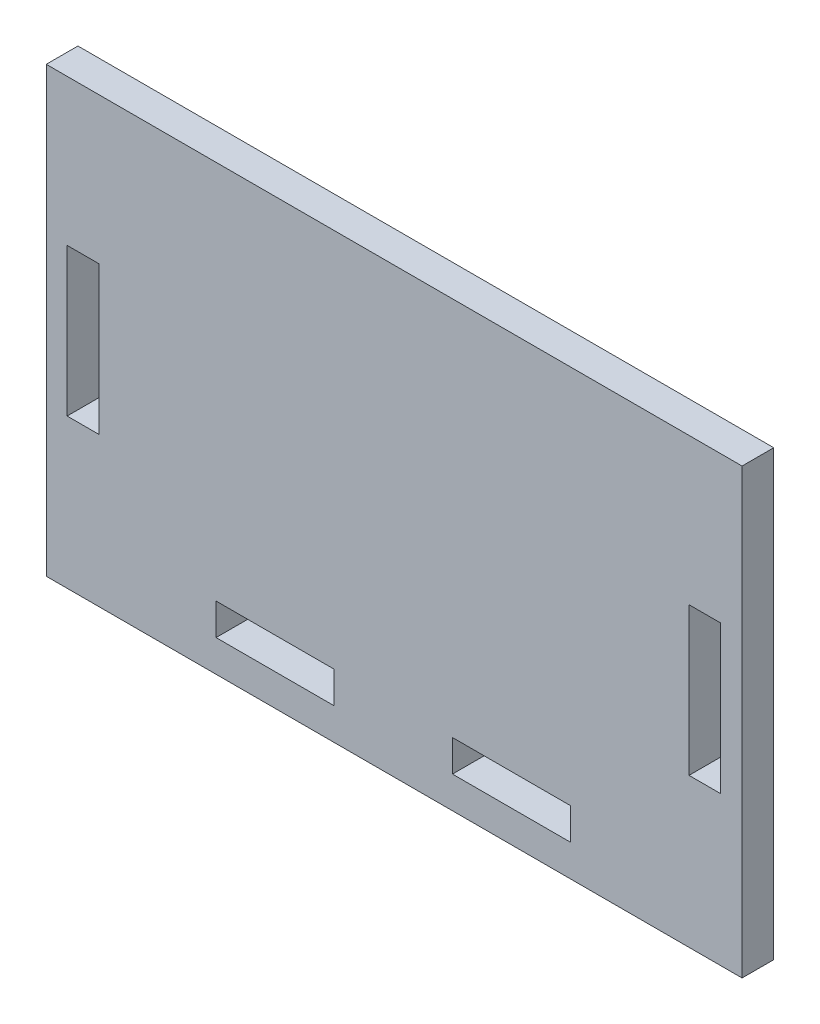
ISO-10303-21;
HEADER;
FILE_DESCRIPTION(('STEP AP214'),'2;1');
FILE_NAME('part.step','',(''),(''),'','','');
FILE_SCHEMA(('AUTOMOTIVE_DESIGN { 1 0 10303 214 1 1 1 1 }'));
ENDSEC;
DATA;
#1=APPLICATION_CONTEXT('core data for automotive mechanical design processes');
#2=APPLICATION_PROTOCOL_DEFINITION('international standard','automotive_design',2000,#1);
#3=PRODUCT_CONTEXT('',#1,'mechanical');
#4=PRODUCT('Part','Part','',(#3));
#5=PRODUCT_RELATED_PRODUCT_CATEGORY('part','',(#4));
#6=PRODUCT_DEFINITION_FORMATION('','',#4);
#7=PRODUCT_DEFINITION_CONTEXT('part definition',#1,'design');
#8=PRODUCT_DEFINITION('design','',#6,#7);
#9=PRODUCT_DEFINITION_SHAPE('','',#8);
#10=(LENGTH_UNIT() NAMED_UNIT(*) SI_UNIT(.MILLI.,.METRE.));
#11=(NAMED_UNIT(*) PLANE_ANGLE_UNIT() SI_UNIT($,.RADIAN.));
#12=(NAMED_UNIT(*) SI_UNIT($,.STERADIAN.) SOLID_ANGLE_UNIT());
#13=UNCERTAINTY_MEASURE_WITH_UNIT(LENGTH_MEASURE(1.E-05),#10,'distance_accuracy_value','');
#14=(GEOMETRIC_REPRESENTATION_CONTEXT(3) GLOBAL_UNCERTAINTY_ASSIGNED_CONTEXT((#13)) GLOBAL_UNIT_ASSIGNED_CONTEXT((#10,
#11,#12)) REPRESENTATION_CONTEXT('',''));
#15=CARTESIAN_POINT('',(0.,0.,0.));
#16=DIRECTION('',(0.,0.,1.));
#17=DIRECTION('',(1.,0.,0.));
#18=AXIS2_PLACEMENT_3D('',#15,#16,#17);
#19=CARTESIAN_POINT('',(0.,0.,3.));
#20=DIRECTION('',(0.,0.,1.));
#21=DIRECTION('',(1.,0.,0.));
#22=AXIS2_PLACEMENT_3D('',#19,#20,#21);
#23=PLANE('',#22);
#24=DIRECTION('',(0.,-1.,0.));
#25=VECTOR('',#24,1.);
#26=CARTESIAN_POINT('',(0.253835648564402,41.7682431755537,3.));
#27=LINE('',#26,#25);
#28=CARTESIAN_POINT('',(0.253835648564402,41.7682431755537,3.));
#29=VERTEX_POINT('',#28);
#30=CARTESIAN_POINT('',(0.253835648564407,-0.231756824446303,3.));
#31=VERTEX_POINT('',#30);
#32=EDGE_CURVE('E299',#29,#31,#27,.T.);
#33=ORIENTED_EDGE('',*,*,#32,.T.);
#34=DIRECTION('',(1.,0.,0.));
#35=VECTOR('',#34,1.);
#36=CARTESIAN_POINT('',(0.253835648564407,-0.231756824446303,3.));
#37=LINE('',#36,#35);
#38=CARTESIAN_POINT('',(66.1638356485644,-0.231756824446303,3.));
#39=VERTEX_POINT('',#38);
#40=EDGE_CURVE('E302',#31,#39,#37,.T.);
#41=ORIENTED_EDGE('',*,*,#40,.T.);
#42=DIRECTION('',(0.,1.,0.));
#43=VECTOR('',#42,1.);
#44=CARTESIAN_POINT('',(66.1638356485644,41.7682431755537,3.));
#45=LINE('',#44,#43);
#46=CARTESIAN_POINT('',(66.1638356485644,41.7682431755537,3.));
#47=VERTEX_POINT('',#46);
#48=EDGE_CURVE('E305',#39,#47,#45,.T.);
#49=ORIENTED_EDGE('',*,*,#48,.T.);
#50=DIRECTION('',(-1.,0.,0.));
#51=VECTOR('',#50,1.);
#52=CARTESIAN_POINT('',(0.253835648564402,41.7682431755537,3.));
#53=LINE('',#52,#51);
#54=EDGE_CURVE('E307',#47,#29,#53,.T.);
#55=ORIENTED_EDGE('',*,*,#54,.T.);
#56=EDGE_LOOP('',(#33,#41,#49,#55));
#57=FACE_BOUND('',#56,.T.);
#58=DIRECTION('',(1.,0.,0.));
#59=VECTOR('',#58,1.);
#60=CARTESIAN_POINT('',(64.1411254267085,13.8773632460001,3.));
#61=LINE('',#60,#59);
#62=CARTESIAN_POINT('',(61.1366118367289,13.8773632460001,3.));
#63=VERTEX_POINT('',#62);
#64=CARTESIAN_POINT('',(64.1411254267085,13.8773632460001,3.));
#65=VERTEX_POINT('',#64);
#66=EDGE_CURVE('E270',#63,#65,#61,.T.);
#67=ORIENTED_EDGE('',*,*,#66,.F.);
#68=DIRECTION('',(0.,-1.,0.));
#69=VECTOR('',#68,1.);
#70=CARTESIAN_POINT('',(61.1366118367289,27.8773632460001,3.));
#71=LINE('',#70,#69);
#72=CARTESIAN_POINT('',(61.1366118367289,27.8773632460001,3.));
#73=VERTEX_POINT('',#72);
#74=EDGE_CURVE('E268',#73,#63,#71,.T.);
#75=ORIENTED_EDGE('',*,*,#74,.F.);
#76=DIRECTION('',(-1.,0.,0.));
#77=VECTOR('',#76,1.);
#78=CARTESIAN_POINT('',(64.1411254267085,27.8773632460001,3.));
#79=LINE('',#78,#77);
#80=CARTESIAN_POINT('',(64.1411254267085,27.8773632460001,3.));
#81=VERTEX_POINT('',#80);
#82=EDGE_CURVE('E276',#81,#73,#79,.T.);
#83=ORIENTED_EDGE('',*,*,#82,.F.);
#84=DIRECTION('',(0.,1.,0.));
#85=VECTOR('',#84,1.);
#86=CARTESIAN_POINT('',(64.1411254267085,27.8773632460001,3.));
#87=LINE('',#86,#85);
#88=EDGE_CURVE('E273',#65,#81,#87,.T.);
#89=ORIENTED_EDGE('',*,*,#88,.F.);
#90=EDGE_LOOP('',(#67,#75,#83,#89));
#91=FACE_BOUND('',#90,.T.);
#92=DIRECTION('',(1.,0.,0.));
#93=VECTOR('',#92,1.);
#94=CARTESIAN_POINT('',(2.23112542670845,13.9014826800209,3.));
#95=LINE('',#94,#93);
#96=CARTESIAN_POINT('',(2.23112542670845,13.9014826800209,3.));
#97=VERTEX_POINT('',#96);
#98=CARTESIAN_POINT('',(5.23112542670845,13.9014826800209,3.));
#99=VERTEX_POINT('',#98);
#100=EDGE_CURVE('E239',#97,#99,#95,.T.);
#101=ORIENTED_EDGE('',*,*,#100,.F.);
#102=DIRECTION('',(0.,-1.,0.));
#103=VECTOR('',#102,1.);
#104=CARTESIAN_POINT('',(2.23112542670844,27.9014826800209,3.));
#105=LINE('',#104,#103);
#106=CARTESIAN_POINT('',(2.23112542670844,27.9014826800209,3.));
#107=VERTEX_POINT('',#106);
#108=EDGE_CURVE('E237',#107,#97,#105,.T.);
#109=ORIENTED_EDGE('',*,*,#108,.F.);
#110=DIRECTION('',(-1.,0.,0.));
#111=VECTOR('',#110,1.);
#112=CARTESIAN_POINT('',(2.23112542670844,27.9014826800209,3.));
#113=LINE('',#112,#111);
#114=CARTESIAN_POINT('',(5.23112542670844,27.9014826800209,3.));
#115=VERTEX_POINT('',#114);
#116=EDGE_CURVE('E245',#115,#107,#113,.T.);
#117=ORIENTED_EDGE('',*,*,#116,.F.);
#118=DIRECTION('',(0.,1.,0.));
#119=VECTOR('',#118,1.);
#120=CARTESIAN_POINT('',(5.23112542670844,27.9014826800209,3.));
#121=LINE('',#120,#119);
#122=EDGE_CURVE('E242',#99,#115,#121,.T.);
#123=ORIENTED_EDGE('',*,*,#122,.F.);
#124=EDGE_LOOP('',(#101,#109,#117,#123));
#125=FACE_BOUND('',#124,.T.);
#126=DIRECTION('',(-1.,0.,0.));
#127=VECTOR('',#126,1.);
#128=CARTESIAN_POINT('',(49.9325588259717,5.77977339852279,3.));
#129=LINE('',#128,#127);
#130=CARTESIAN_POINT('',(49.9325588259717,5.77977339852279,3.));
#131=VERTEX_POINT('',#130);
#132=CARTESIAN_POINT('',(38.7309015514177,5.77977339852279,3.));
#133=VERTEX_POINT('',#132);
#134=EDGE_CURVE('E208',#131,#133,#129,.T.);
#135=ORIENTED_EDGE('',*,*,#134,.F.);
#136=DIRECTION('',(0.,1.,0.));
#137=VECTOR('',#136,1.);
#138=CARTESIAN_POINT('',(49.9325588259717,2.7797733985228,3.));
#139=LINE('',#138,#137);
#140=CARTESIAN_POINT('',(49.9325588259717,2.7797733985228,3.));
#141=VERTEX_POINT('',#140);
#142=EDGE_CURVE('E206',#141,#131,#139,.T.);
#143=ORIENTED_EDGE('',*,*,#142,.F.);
#144=DIRECTION('',(1.,0.,0.));
#145=VECTOR('',#144,1.);
#146=CARTESIAN_POINT('',(49.9325588259717,2.7797733985228,3.));
#147=LINE('',#146,#145);
#148=CARTESIAN_POINT('',(38.7309015514177,2.77977339852279,3.));
#149=VERTEX_POINT('',#148);
#150=EDGE_CURVE('E214',#149,#141,#147,.T.);
#151=ORIENTED_EDGE('',*,*,#150,.F.);
#152=DIRECTION('',(0.,-1.,0.));
#153=VECTOR('',#152,1.);
#154=CARTESIAN_POINT('',(38.7309015514177,2.77977339852279,3.));
#155=LINE('',#154,#153);
#156=EDGE_CURVE('E211',#133,#149,#155,.T.);
#157=ORIENTED_EDGE('',*,*,#156,.F.);
#158=EDGE_LOOP('',(#135,#143,#151,#157));
#159=FACE_BOUND('',#158,.T.);
#160=DIRECTION('',(-1.,0.,0.));
#161=VECTOR('',#160,1.);
#162=CARTESIAN_POINT('',(27.5325588259717,5.77977339852279,3.));
#163=LINE('',#162,#161);
#164=CARTESIAN_POINT('',(27.5325588259717,5.77977339852279,3.));
#165=VERTEX_POINT('',#164);
#166=CARTESIAN_POINT('',(16.3375357648547,5.77977339852279,3.));
#167=VERTEX_POINT('',#166);
#168=EDGE_CURVE('E178',#165,#167,#163,.T.);
#169=ORIENTED_EDGE('',*,*,#168,.F.);
#170=DIRECTION('',(0.,1.,0.));
#171=VECTOR('',#170,1.);
#172=CARTESIAN_POINT('',(27.5325588259717,2.77977339852279,3.));
#173=LINE('',#172,#171);
#174=CARTESIAN_POINT('',(27.5325588259717,2.77977339852279,3.));
#175=VERTEX_POINT('',#174);
#176=EDGE_CURVE('E170',#175,#165,#173,.T.);
#177=ORIENTED_EDGE('',*,*,#176,.F.);
#178=DIRECTION('',(1.,0.,0.));
#179=VECTOR('',#178,1.);
#180=CARTESIAN_POINT('',(27.5325588259717,2.77977339852279,3.));
#181=LINE('',#180,#179);
#182=CARTESIAN_POINT('',(16.3375357648547,2.77977339852279,3.));
#183=VERTEX_POINT('',#182);
#184=EDGE_CURVE('E192',#183,#175,#181,.T.);
#185=ORIENTED_EDGE('',*,*,#184,.F.);
#186=DIRECTION('',(0.,-1.,0.));
#187=VECTOR('',#186,1.);
#188=CARTESIAN_POINT('',(16.3375357648547,2.77977339852279,3.));
#189=LINE('',#188,#187);
#190=EDGE_CURVE('E190',#167,#183,#189,.T.);
#191=ORIENTED_EDGE('',*,*,#190,.F.);
#192=EDGE_LOOP('',(#169,#177,#185,#191));
#193=FACE_BOUND('',#192,.T.);
#194=ADVANCED_FACE('F33',(#57,#91,#125,#159,#193),#23,.T.);
#195=CARTESIAN_POINT('',(0.,0.,0.));
#196=DIRECTION('',(0.,0.,1.));
#197=DIRECTION('',(1.,0.,0.));
#198=AXIS2_PLACEMENT_3D('',#195,#196,#197);
#199=PLANE('',#198);
#200=DIRECTION('',(0.,1.,0.));
#201=VECTOR('',#200,1.);
#202=CARTESIAN_POINT('',(49.9325588259717,2.7797733985228,0.));
#203=LINE('',#202,#201);
#204=CARTESIAN_POINT('',(49.9325588259717,2.7797733985228,0.));
#205=VERTEX_POINT('',#204);
#206=CARTESIAN_POINT('',(49.9325588259717,5.77977339852279,0.));
#207=VERTEX_POINT('',#206);
#208=EDGE_CURVE('E186',#205,#207,#203,.T.);
#209=ORIENTED_EDGE('',*,*,#208,.T.);
#210=DIRECTION('',(-1.,0.,0.));
#211=VECTOR('',#210,1.);
#212=CARTESIAN_POINT('',(49.9325588259717,5.77977339852279,0.));
#213=LINE('',#212,#211);
#214=CARTESIAN_POINT('',(38.7309015514177,5.77977339852279,0.));
#215=VERTEX_POINT('',#214);
#216=EDGE_CURVE('E219',#207,#215,#213,.T.);
#217=ORIENTED_EDGE('',*,*,#216,.T.);
#218=DIRECTION('',(0.,-1.,0.));
#219=VECTOR('',#218,1.);
#220=CARTESIAN_POINT('',(38.7309015514177,2.77977339852279,0.));
#221=LINE('',#220,#219);
#222=CARTESIAN_POINT('',(38.7309015514177,2.77977339852279,0.));
#223=VERTEX_POINT('',#222);
#224=EDGE_CURVE('E222',#215,#223,#221,.T.);
#225=ORIENTED_EDGE('',*,*,#224,.T.);
#226=DIRECTION('',(1.,0.,0.));
#227=VECTOR('',#226,1.);
#228=CARTESIAN_POINT('',(49.9325588259717,2.7797733985228,0.));
#229=LINE('',#228,#227);
#230=EDGE_CURVE('E209',#223,#205,#229,.T.);
#231=ORIENTED_EDGE('',*,*,#230,.T.);
#232=EDGE_LOOP('',(#209,#217,#225,#231));
#233=FACE_BOUND('',#232,.T.);
#234=DIRECTION('',(0.,-1.,0.));
#235=VECTOR('',#234,1.);
#236=CARTESIAN_POINT('',(61.1366118367289,27.8773632460001,0.));
#237=LINE('',#236,#235);
#238=CARTESIAN_POINT('',(61.1366118367289,27.8773632460001,0.));
#239=VERTEX_POINT('',#238);
#240=CARTESIAN_POINT('',(61.1366118367289,13.8773632460001,0.));
#241=VERTEX_POINT('',#240);
#242=EDGE_CURVE('E267',#239,#241,#237,.T.);
#243=ORIENTED_EDGE('',*,*,#242,.T.);
#244=DIRECTION('',(1.,0.,0.));
#245=VECTOR('',#244,1.);
#246=CARTESIAN_POINT('',(64.1411254267085,13.8773632460001,0.));
#247=LINE('',#246,#245);
#248=CARTESIAN_POINT('',(64.1411254267085,13.8773632460001,0.));
#249=VERTEX_POINT('',#248);
#250=EDGE_CURVE('E281',#241,#249,#247,.T.);
#251=ORIENTED_EDGE('',*,*,#250,.T.);
#252=DIRECTION('',(0.,1.,0.));
#253=VECTOR('',#252,1.);
#254=CARTESIAN_POINT('',(64.1411254267085,27.8773632460001,0.));
#255=LINE('',#254,#253);
#256=CARTESIAN_POINT('',(64.1411254267085,27.8773632460001,0.));
#257=VERTEX_POINT('',#256);
#258=EDGE_CURVE('E284',#249,#257,#255,.T.);
#259=ORIENTED_EDGE('',*,*,#258,.T.);
#260=DIRECTION('',(-1.,0.,0.));
#261=VECTOR('',#260,1.);
#262=CARTESIAN_POINT('',(64.1411254267085,27.8773632460001,0.));
#263=LINE('',#262,#261);
#264=EDGE_CURVE('E271',#257,#239,#263,.T.);
#265=ORIENTED_EDGE('',*,*,#264,.T.);
#266=EDGE_LOOP('',(#243,#251,#259,#265));
#267=FACE_BOUND('',#266,.T.);
#268=DIRECTION('',(0.,-1.,0.));
#269=VECTOR('',#268,1.);
#270=CARTESIAN_POINT('',(0.253835648564402,41.7682431755537,0.));
#271=LINE('',#270,#269);
#272=CARTESIAN_POINT('',(0.253835648564402,41.7682431755537,0.));
#273=VERTEX_POINT('',#272);
#274=CARTESIAN_POINT('',(0.253835648564407,-0.231756824446303,0.));
#275=VERTEX_POINT('',#274);
#276=EDGE_CURVE('E298',#273,#275,#271,.T.);
#277=ORIENTED_EDGE('',*,*,#276,.F.);
#278=DIRECTION('',(-1.,0.,0.));
#279=VECTOR('',#278,1.);
#280=CARTESIAN_POINT('',(0.253835648564402,41.7682431755537,0.));
#281=LINE('',#280,#279);
#282=CARTESIAN_POINT('',(66.1638356485644,41.7682431755537,0.));
#283=VERTEX_POINT('',#282);
#284=EDGE_CURVE('E303',#283,#273,#281,.T.);
#285=ORIENTED_EDGE('',*,*,#284,.F.);
#286=DIRECTION('',(0.,1.,0.));
#287=VECTOR('',#286,1.);
#288=CARTESIAN_POINT('',(66.1638356485644,41.7682431755537,0.));
#289=LINE('',#288,#287);
#290=CARTESIAN_POINT('',(66.1638356485644,-0.231756824446303,0.));
#291=VERTEX_POINT('',#290);
#292=EDGE_CURVE('E314',#291,#283,#289,.T.);
#293=ORIENTED_EDGE('',*,*,#292,.F.);
#294=DIRECTION('',(1.,0.,0.));
#295=VECTOR('',#294,1.);
#296=CARTESIAN_POINT('',(0.253835648564407,-0.231756824446303,0.));
#297=LINE('',#296,#295);
#298=EDGE_CURVE('E312',#275,#291,#297,.T.);
#299=ORIENTED_EDGE('',*,*,#298,.F.);
#300=EDGE_LOOP('',(#277,#285,#293,#299));
#301=FACE_BOUND('',#300,.T.);
#302=DIRECTION('',(0.,-1.,0.));
#303=VECTOR('',#302,1.);
#304=CARTESIAN_POINT('',(2.23112542670844,27.9014826800209,0.));
#305=LINE('',#304,#303);
#306=CARTESIAN_POINT('',(2.23112542670844,27.9014826800209,0.));
#307=VERTEX_POINT('',#306);
#308=CARTESIAN_POINT('',(2.23112542670845,13.9014826800209,0.));
#309=VERTEX_POINT('',#308);
#310=EDGE_CURVE('E236',#307,#309,#305,.T.);
#311=ORIENTED_EDGE('',*,*,#310,.T.);
#312=DIRECTION('',(1.,0.,0.));
#313=VECTOR('',#312,1.);
#314=CARTESIAN_POINT('',(2.23112542670845,13.9014826800209,0.));
#315=LINE('',#314,#313);
#316=CARTESIAN_POINT('',(5.23112542670845,13.9014826800209,0.));
#317=VERTEX_POINT('',#316);
#318=EDGE_CURVE('E250',#309,#317,#315,.T.);
#319=ORIENTED_EDGE('',*,*,#318,.T.);
#320=DIRECTION('',(0.,1.,0.));
#321=VECTOR('',#320,1.);
#322=CARTESIAN_POINT('',(5.23112542670844,27.9014826800209,0.));
#323=LINE('',#322,#321);
#324=CARTESIAN_POINT('',(5.23112542670844,27.9014826800209,0.));
#325=VERTEX_POINT('',#324);
#326=EDGE_CURVE('E253',#317,#325,#323,.T.);
#327=ORIENTED_EDGE('',*,*,#326,.T.);
#328=DIRECTION('',(-1.,0.,0.));
#329=VECTOR('',#328,1.);
#330=CARTESIAN_POINT('',(2.23112542670844,27.9014826800209,0.));
#331=LINE('',#330,#329);
#332=EDGE_CURVE('E240',#325,#307,#331,.T.);
#333=ORIENTED_EDGE('',*,*,#332,.T.);
#334=EDGE_LOOP('',(#311,#319,#327,#333));
#335=FACE_BOUND('',#334,.T.);
#336=DIRECTION('',(0.,1.,0.));
#337=VECTOR('',#336,1.);
#338=CARTESIAN_POINT('',(27.5325588259717,2.77977339852279,0.));
#339=LINE('',#338,#337);
#340=CARTESIAN_POINT('',(27.5325588259717,2.77977339852279,0.));
#341=VERTEX_POINT('',#340);
#342=CARTESIAN_POINT('',(27.5325588259717,5.77977339852279,0.));
#343=VERTEX_POINT('',#342);
#344=EDGE_CURVE('E56',#341,#343,#339,.T.);
#345=ORIENTED_EDGE('',*,*,#344,.T.);
#346=DIRECTION('',(-1.,0.,0.));
#347=VECTOR('',#346,1.);
#348=CARTESIAN_POINT('',(27.5325588259717,5.77977339852279,0.));
#349=LINE('',#348,#347);
#350=CARTESIAN_POINT('',(16.3375357648547,5.77977339852279,0.));
#351=VERTEX_POINT('',#350);
#352=EDGE_CURVE('E185',#343,#351,#349,.T.);
#353=ORIENTED_EDGE('',*,*,#352,.T.);
#354=DIRECTION('',(0.,-1.,0.));
#355=VECTOR('',#354,1.);
#356=CARTESIAN_POINT('',(16.3375357648547,2.77977339852279,0.));
#357=LINE('',#356,#355);
#358=CARTESIAN_POINT('',(16.3375357648547,2.77977339852279,0.));
#359=VERTEX_POINT('',#358);
#360=EDGE_CURVE('E198',#351,#359,#357,.T.);
#361=ORIENTED_EDGE('',*,*,#360,.T.);
#362=DIRECTION('',(1.,0.,0.));
#363=VECTOR('',#362,1.);
#364=CARTESIAN_POINT('',(27.5325588259717,2.77977339852279,0.));
#365=LINE('',#364,#363);
#366=EDGE_CURVE('E179',#359,#341,#365,.T.);
#367=ORIENTED_EDGE('',*,*,#366,.T.);
#368=EDGE_LOOP('',(#345,#353,#361,#367));
#369=FACE_BOUND('',#368,.T.);
#370=ADVANCED_FACE('F332',(#233,#267,#301,#335,#369),#199,.F.);
#371=CARTESIAN_POINT('',(0.253835648564402,41.7682431755537,3.));
#372=DIRECTION('',(1.,0.,0.));
#373=DIRECTION('',(0.,1.,0.));
#374=AXIS2_PLACEMENT_3D('',#371,#372,#373);
#375=PLANE('',#374);
#376=ORIENTED_EDGE('',*,*,#276,.T.);
#377=DIRECTION('',(0.,0.,-1.));
#378=VECTOR('',#377,1.);
#379=CARTESIAN_POINT('',(0.253835648564407,-0.231756824446303,3.));
#380=LINE('',#379,#378);
#381=EDGE_CURVE('E11',#31,#275,#380,.T.);
#382=ORIENTED_EDGE('',*,*,#381,.F.);
#383=ORIENTED_EDGE('',*,*,#32,.F.);
#384=DIRECTION('',(0.,0.,-1.));
#385=VECTOR('',#384,1.);
#386=CARTESIAN_POINT('',(0.253835648564402,41.7682431755537,3.));
#387=LINE('',#386,#385);
#388=EDGE_CURVE('E309',#29,#273,#387,.T.);
#389=ORIENTED_EDGE('',*,*,#388,.T.);
#390=EDGE_LOOP('',(#376,#382,#383,#389));
#391=FACE_BOUND('',#390,.T.);
#392=ADVANCED_FACE('F35',(#391),#375,.F.);
#393=CARTESIAN_POINT('',(0.253835648564407,-0.231756824446303,3.));
#394=DIRECTION('',(0.,1.,0.));
#395=DIRECTION('',(0.,0.,1.));
#396=AXIS2_PLACEMENT_3D('',#393,#394,#395);
#397=PLANE('',#396);
#398=ORIENTED_EDGE('',*,*,#298,.T.);
#399=DIRECTION('',(0.,0.,-1.));
#400=VECTOR('',#399,1.);
#401=CARTESIAN_POINT('',(66.1638356485644,-0.231756824446303,3.));
#402=LINE('',#401,#400);
#403=EDGE_CURVE('E41',#39,#291,#402,.T.);
#404=ORIENTED_EDGE('',*,*,#403,.F.);
#405=ORIENTED_EDGE('',*,*,#40,.F.);
#406=ORIENTED_EDGE('',*,*,#381,.T.);
#407=EDGE_LOOP('',(#398,#404,#405,#406));
#408=FACE_BOUND('',#407,.T.);
#409=ADVANCED_FACE('F343',(#408),#397,.F.);
#410=CARTESIAN_POINT('',(66.1638356485644,41.7682431755537,3.));
#411=DIRECTION('',(-1.,0.,0.));
#412=DIRECTION('',(0.,0.,1.));
#413=AXIS2_PLACEMENT_3D('',#410,#411,#412);
#414=PLANE('',#413);
#415=ORIENTED_EDGE('',*,*,#292,.T.);
#416=DIRECTION('',(0.,0.,-1.));
#417=VECTOR('',#416,1.);
#418=CARTESIAN_POINT('',(66.1638356485644,41.7682431755537,3.));
#419=LINE('',#418,#417);
#420=EDGE_CURVE('E319',#47,#283,#419,.T.);
#421=ORIENTED_EDGE('',*,*,#420,.F.);
#422=ORIENTED_EDGE('',*,*,#48,.F.);
#423=ORIENTED_EDGE('',*,*,#403,.T.);
#424=EDGE_LOOP('',(#415,#421,#422,#423));
#425=FACE_BOUND('',#424,.T.);
#426=ADVANCED_FACE('F326',(#425),#414,.F.);
#427=CARTESIAN_POINT('',(0.253835648564402,41.7682431755537,3.));
#428=DIRECTION('',(0.,-1.,0.));
#429=DIRECTION('',(0.,0.,-1.));
#430=AXIS2_PLACEMENT_3D('',#427,#428,#429);
#431=PLANE('',#430);
#432=ORIENTED_EDGE('',*,*,#284,.T.);
#433=ORIENTED_EDGE('',*,*,#388,.F.);
#434=ORIENTED_EDGE('',*,*,#54,.F.);
#435=ORIENTED_EDGE('',*,*,#420,.T.);
#436=EDGE_LOOP('',(#432,#433,#434,#435));
#437=FACE_BOUND('',#436,.T.);
#438=ADVANCED_FACE('F336',(#437),#431,.F.);
#439=CARTESIAN_POINT('',(61.1366118367289,27.8773632460001,3.));
#440=DIRECTION('',(1.,0.,0.));
#441=DIRECTION('',(0.,0.,-1.));
#442=AXIS2_PLACEMENT_3D('',#439,#440,#441);
#443=PLANE('',#442);
#444=ORIENTED_EDGE('',*,*,#242,.F.);
#445=DIRECTION('',(0.,0.,-1.));
#446=VECTOR('',#445,1.);
#447=CARTESIAN_POINT('',(61.1366118367289,27.8773632460001,3.));
#448=LINE('',#447,#446);
#449=EDGE_CURVE('E278',#73,#239,#448,.T.);
#450=ORIENTED_EDGE('',*,*,#449,.F.);
#451=ORIENTED_EDGE('',*,*,#74,.T.);
#452=DIRECTION('',(0.,0.,-1.));
#453=VECTOR('',#452,1.);
#454=CARTESIAN_POINT('',(61.1366118367289,13.8773632460001,3.));
#455=LINE('',#454,#453);
#456=EDGE_CURVE('E295',#63,#241,#455,.T.);
#457=ORIENTED_EDGE('',*,*,#456,.T.);
#458=EDGE_LOOP('',(#444,#450,#451,#457));
#459=FACE_BOUND('',#458,.T.);
#460=ADVANCED_FACE('F358',(#459),#443,.T.);
#461=CARTESIAN_POINT('',(64.1411254267085,13.8773632460001,3.));
#462=DIRECTION('',(0.,1.,0.));
#463=DIRECTION('',(0.,0.,1.));
#464=AXIS2_PLACEMENT_3D('',#461,#462,#463);
#465=PLANE('',#464);
#466=ORIENTED_EDGE('',*,*,#250,.F.);
#467=ORIENTED_EDGE('',*,*,#456,.F.);
#468=ORIENTED_EDGE('',*,*,#66,.T.);
#469=DIRECTION('',(0.,0.,-1.));
#470=VECTOR('',#469,1.);
#471=CARTESIAN_POINT('',(64.1411254267085,13.8773632460001,3.));
#472=LINE('',#471,#470);
#473=EDGE_CURVE('E293',#65,#249,#472,.T.);
#474=ORIENTED_EDGE('',*,*,#473,.T.);
#475=EDGE_LOOP('',(#466,#467,#468,#474));
#476=FACE_BOUND('',#475,.T.);
#477=ADVANCED_FACE('F365',(#476),#465,.T.);
#478=CARTESIAN_POINT('',(64.1411254267085,27.8773632460001,3.));
#479=DIRECTION('',(-1.,0.,0.));
#480=DIRECTION('',(0.,0.,1.));
#481=AXIS2_PLACEMENT_3D('',#478,#479,#480);
#482=PLANE('',#481);
#483=ORIENTED_EDGE('',*,*,#258,.F.);
#484=ORIENTED_EDGE('',*,*,#473,.F.);
#485=ORIENTED_EDGE('',*,*,#88,.T.);
#486=DIRECTION('',(0.,0.,-1.));
#487=VECTOR('',#486,1.);
#488=CARTESIAN_POINT('',(64.1411254267085,27.8773632460001,3.));
#489=LINE('',#488,#487);
#490=EDGE_CURVE('E291',#81,#257,#489,.T.);
#491=ORIENTED_EDGE('',*,*,#490,.T.);
#492=EDGE_LOOP('',(#483,#484,#485,#491));
#493=FACE_BOUND('',#492,.T.);
#494=ADVANCED_FACE('F370',(#493),#482,.T.);
#495=CARTESIAN_POINT('',(64.1411254267085,27.8773632460001,3.));
#496=DIRECTION('',(0.,-1.,0.));
#497=DIRECTION('',(0.,0.,-1.));
#498=AXIS2_PLACEMENT_3D('',#495,#496,#497);
#499=PLANE('',#498);
#500=ORIENTED_EDGE('',*,*,#264,.F.);
#501=ORIENTED_EDGE('',*,*,#490,.F.);
#502=ORIENTED_EDGE('',*,*,#82,.T.);
#503=ORIENTED_EDGE('',*,*,#449,.T.);
#504=EDGE_LOOP('',(#500,#501,#502,#503));
#505=FACE_BOUND('',#504,.T.);
#506=ADVANCED_FACE('F378',(#505),#499,.T.);
#507=CARTESIAN_POINT('',(2.23112542670844,27.9014826800209,3.));
#508=DIRECTION('',(1.,0.,0.));
#509=DIRECTION('',(0.,1.,0.));
#510=AXIS2_PLACEMENT_3D('',#507,#508,#509);
#511=PLANE('',#510);
#512=ORIENTED_EDGE('',*,*,#310,.F.);
#513=DIRECTION('',(0.,0.,-1.));
#514=VECTOR('',#513,1.);
#515=CARTESIAN_POINT('',(2.23112542670844,27.9014826800209,3.));
#516=LINE('',#515,#514);
#517=EDGE_CURVE('E247',#107,#307,#516,.T.);
#518=ORIENTED_EDGE('',*,*,#517,.F.);
#519=ORIENTED_EDGE('',*,*,#108,.T.);
#520=DIRECTION('',(0.,0.,-1.));
#521=VECTOR('',#520,1.);
#522=CARTESIAN_POINT('',(2.23112542670845,13.9014826800209,3.));
#523=LINE('',#522,#521);
#524=EDGE_CURVE('E264',#97,#309,#523,.T.);
#525=ORIENTED_EDGE('',*,*,#524,.T.);
#526=EDGE_LOOP('',(#512,#518,#519,#525));
#527=FACE_BOUND('',#526,.T.);
#528=ADVANCED_FACE('F432',(#527),#511,.T.);
#529=CARTESIAN_POINT('',(2.23112542670845,13.9014826800209,3.));
#530=DIRECTION('',(0.,1.,0.));
#531=DIRECTION('',(0.,0.,1.));
#532=AXIS2_PLACEMENT_3D('',#529,#530,#531);
#533=PLANE('',#532);
#534=ORIENTED_EDGE('',*,*,#318,.F.);
#535=ORIENTED_EDGE('',*,*,#524,.F.);
#536=ORIENTED_EDGE('',*,*,#100,.T.);
#537=DIRECTION('',(0.,0.,-1.));
#538=VECTOR('',#537,1.);
#539=CARTESIAN_POINT('',(5.23112542670845,13.9014826800209,3.));
#540=LINE('',#539,#538);
#541=EDGE_CURVE('E262',#99,#317,#540,.T.);
#542=ORIENTED_EDGE('',*,*,#541,.T.);
#543=EDGE_LOOP('',(#534,#535,#536,#542));
#544=FACE_BOUND('',#543,.T.);
#545=ADVANCED_FACE('F428',(#544),#533,.T.);
#546=CARTESIAN_POINT('',(5.23112542670844,27.9014826800209,3.));
#547=DIRECTION('',(-1.,0.,0.));
#548=DIRECTION('',(0.,-1.,0.));
#549=AXIS2_PLACEMENT_3D('',#546,#547,#548);
#550=PLANE('',#549);
#551=ORIENTED_EDGE('',*,*,#326,.F.);
#552=ORIENTED_EDGE('',*,*,#541,.F.);
#553=ORIENTED_EDGE('',*,*,#122,.T.);
#554=DIRECTION('',(0.,0.,-1.));
#555=VECTOR('',#554,1.);
#556=CARTESIAN_POINT('',(5.23112542670844,27.9014826800209,3.));
#557=LINE('',#556,#555);
#558=EDGE_CURVE('E260',#115,#325,#557,.T.);
#559=ORIENTED_EDGE('',*,*,#558,.T.);
#560=EDGE_LOOP('',(#551,#552,#553,#559));
#561=FACE_BOUND('',#560,.T.);
#562=ADVANCED_FACE('F424',(#561),#550,.T.);
#563=CARTESIAN_POINT('',(2.23112542670844,27.9014826800209,3.));
#564=DIRECTION('',(0.,-1.,0.));
#565=DIRECTION('',(0.,0.,-1.));
#566=AXIS2_PLACEMENT_3D('',#563,#564,#565);
#567=PLANE('',#566);
#568=ORIENTED_EDGE('',*,*,#332,.F.);
#569=ORIENTED_EDGE('',*,*,#558,.F.);
#570=ORIENTED_EDGE('',*,*,#116,.T.);
#571=ORIENTED_EDGE('',*,*,#517,.T.);
#572=EDGE_LOOP('',(#568,#569,#570,#571));
#573=FACE_BOUND('',#572,.T.);
#574=ADVANCED_FACE('F421',(#573),#567,.T.);
#575=CARTESIAN_POINT('',(49.9325588259717,2.7797733985228,3.));
#576=DIRECTION('',(-1.,0.,0.));
#577=DIRECTION('',(0.,0.,1.));
#578=AXIS2_PLACEMENT_3D('',#575,#576,#577);
#579=PLANE('',#578);
#580=ORIENTED_EDGE('',*,*,#208,.F.);
#581=DIRECTION('',(0.,0.,-1.));
#582=VECTOR('',#581,1.);
#583=CARTESIAN_POINT('',(49.9325588259717,2.7797733985228,3.));
#584=LINE('',#583,#582);
#585=EDGE_CURVE('E216',#141,#205,#584,.T.);
#586=ORIENTED_EDGE('',*,*,#585,.F.);
#587=ORIENTED_EDGE('',*,*,#142,.T.);
#588=DIRECTION('',(0.,0.,-1.));
#589=VECTOR('',#588,1.);
#590=CARTESIAN_POINT('',(49.9325588259717,5.77977339852279,3.));
#591=LINE('',#590,#589);
#592=EDGE_CURVE('E233',#131,#207,#591,.T.);
#593=ORIENTED_EDGE('',*,*,#592,.T.);
#594=EDGE_LOOP('',(#580,#586,#587,#593));
#595=FACE_BOUND('',#594,.T.);
#596=ADVANCED_FACE('F403',(#595),#579,.T.);
#597=CARTESIAN_POINT('',(49.9325588259717,5.77977339852279,3.));
#598=DIRECTION('',(0.,-1.,0.));
#599=DIRECTION('',(0.,0.,-1.));
#600=AXIS2_PLACEMENT_3D('',#597,#598,#599);
#601=PLANE('',#600);
#602=ORIENTED_EDGE('',*,*,#216,.F.);
#603=ORIENTED_EDGE('',*,*,#592,.F.);
#604=ORIENTED_EDGE('',*,*,#134,.T.);
#605=DIRECTION('',(0.,0.,-1.));
#606=VECTOR('',#605,1.);
#607=CARTESIAN_POINT('',(38.7309015514177,5.77977339852279,3.));
#608=LINE('',#607,#606);
#609=EDGE_CURVE('E231',#133,#215,#608,.T.);
#610=ORIENTED_EDGE('',*,*,#609,.T.);
#611=EDGE_LOOP('',(#602,#603,#604,#610));
#612=FACE_BOUND('',#611,.T.);
#613=ADVANCED_FACE('F397',(#612),#601,.T.);
#614=CARTESIAN_POINT('',(38.7309015514177,2.77977339852279,3.));
#615=DIRECTION('',(1.,0.,0.));
#616=DIRECTION('',(0.,0.,-1.));
#617=AXIS2_PLACEMENT_3D('',#614,#615,#616);
#618=PLANE('',#617);
#619=ORIENTED_EDGE('',*,*,#224,.F.);
#620=ORIENTED_EDGE('',*,*,#609,.F.);
#621=ORIENTED_EDGE('',*,*,#156,.T.);
#622=DIRECTION('',(0.,0.,-1.));
#623=VECTOR('',#622,1.);
#624=CARTESIAN_POINT('',(38.7309015514177,2.77977339852279,3.));
#625=LINE('',#624,#623);
#626=EDGE_CURVE('E229',#149,#223,#625,.T.);
#627=ORIENTED_EDGE('',*,*,#626,.T.);
#628=EDGE_LOOP('',(#619,#620,#621,#627));
#629=FACE_BOUND('',#628,.T.);
#630=ADVANCED_FACE('F400',(#629),#618,.T.);
#631=CARTESIAN_POINT('',(49.9325588259717,2.7797733985228,3.));
#632=DIRECTION('',(0.,1.,0.));
#633=DIRECTION('',(-1.,0.,0.));
#634=AXIS2_PLACEMENT_3D('',#631,#632,#633);
#635=PLANE('',#634);
#636=ORIENTED_EDGE('',*,*,#230,.F.);
#637=ORIENTED_EDGE('',*,*,#626,.F.);
#638=ORIENTED_EDGE('',*,*,#150,.T.);
#639=ORIENTED_EDGE('',*,*,#585,.T.);
#640=EDGE_LOOP('',(#636,#637,#638,#639));
#641=FACE_BOUND('',#640,.T.);
#642=ADVANCED_FACE('F406',(#641),#635,.T.);
#643=CARTESIAN_POINT('',(27.5325588259717,2.77977339852279,3.));
#644=DIRECTION('',(-1.,0.,0.));
#645=DIRECTION('',(0.,0.,1.));
#646=AXIS2_PLACEMENT_3D('',#643,#644,#645);
#647=PLANE('',#646);
#648=ORIENTED_EDGE('',*,*,#344,.F.);
#649=DIRECTION('',(0.,0.,-1.));
#650=VECTOR('',#649,1.);
#651=CARTESIAN_POINT('',(27.5325588259717,2.77977339852279,3.));
#652=LINE('',#651,#650);
#653=EDGE_CURVE('E174',#175,#341,#652,.T.);
#654=ORIENTED_EDGE('',*,*,#653,.F.);
#655=ORIENTED_EDGE('',*,*,#176,.T.);
#656=DIRECTION('',(0.,0.,-1.));
#657=VECTOR('',#656,1.);
#658=CARTESIAN_POINT('',(27.5325588259717,5.77977339852279,3.));
#659=LINE('',#658,#657);
#660=EDGE_CURVE('E173',#165,#343,#659,.T.);
#661=ORIENTED_EDGE('',*,*,#660,.T.);
#662=EDGE_LOOP('',(#648,#654,#655,#661));
#663=FACE_BOUND('',#662,.T.);
#664=ADVANCED_FACE('F172',(#663),#647,.T.);
#665=CARTESIAN_POINT('',(27.5325588259717,5.77977339852279,3.));
#666=DIRECTION('',(0.,-1.,0.));
#667=DIRECTION('',(0.,0.,-1.));
#668=AXIS2_PLACEMENT_3D('',#665,#666,#667);
#669=PLANE('',#668);
#670=ORIENTED_EDGE('',*,*,#352,.F.);
#671=ORIENTED_EDGE('',*,*,#660,.F.);
#672=ORIENTED_EDGE('',*,*,#168,.T.);
#673=DIRECTION('',(0.,0.,-1.));
#674=VECTOR('',#673,1.);
#675=CARTESIAN_POINT('',(16.3375357648547,5.77977339852279,3.));
#676=LINE('',#675,#674);
#677=EDGE_CURVE('E187',#167,#351,#676,.T.);
#678=ORIENTED_EDGE('',*,*,#677,.T.);
#679=EDGE_LOOP('',(#670,#671,#672,#678));
#680=FACE_BOUND('',#679,.T.);
#681=ADVANCED_FACE('F182',(#680),#669,.T.);
#682=CARTESIAN_POINT('',(16.3375357648547,2.77977339852279,3.));
#683=DIRECTION('',(1.,0.,0.));
#684=DIRECTION('',(0.,0.,-1.));
#685=AXIS2_PLACEMENT_3D('',#682,#683,#684);
#686=PLANE('',#685);
#687=ORIENTED_EDGE('',*,*,#360,.F.);
#688=ORIENTED_EDGE('',*,*,#677,.F.);
#689=ORIENTED_EDGE('',*,*,#190,.T.);
#690=DIRECTION('',(0.,0.,-1.));
#691=VECTOR('',#690,1.);
#692=CARTESIAN_POINT('',(16.3375357648547,2.77977339852279,3.));
#693=LINE('',#692,#691);
#694=EDGE_CURVE('E48',#183,#359,#693,.T.);
#695=ORIENTED_EDGE('',*,*,#694,.T.);
#696=EDGE_LOOP('',(#687,#688,#689,#695));
#697=FACE_BOUND('',#696,.T.);
#698=ADVANCED_FACE('F495',(#697),#686,.T.);
#699=CARTESIAN_POINT('',(27.5325588259717,2.77977339852279,3.));
#700=DIRECTION('',(0.,1.,0.));
#701=DIRECTION('',(-1.,0.,0.));
#702=AXIS2_PLACEMENT_3D('',#699,#700,#701);
#703=PLANE('',#702);
#704=ORIENTED_EDGE('',*,*,#366,.F.);
#705=ORIENTED_EDGE('',*,*,#694,.F.);
#706=ORIENTED_EDGE('',*,*,#184,.T.);
#707=ORIENTED_EDGE('',*,*,#653,.T.);
#708=EDGE_LOOP('',(#704,#705,#706,#707));
#709=FACE_BOUND('',#708,.T.);
#710=ADVANCED_FACE('F503',(#709),#703,.T.);
#711=CLOSED_SHELL('',(#194,#370,#392,#409,#426,#438,#460,#477,#494,#506,#528,#545,#562,#574,
#596,#613,#630,#642,#664,#681,#698,#710));
#712=MANIFOLD_SOLID_BREP('B2',#711);
#713=ADVANCED_BREP_SHAPE_REPRESENTATION('',(#18,#712),#14);
#714=SHAPE_DEFINITION_REPRESENTATION(#9,#713);
ENDSEC;
END-ISO-10303-21;
